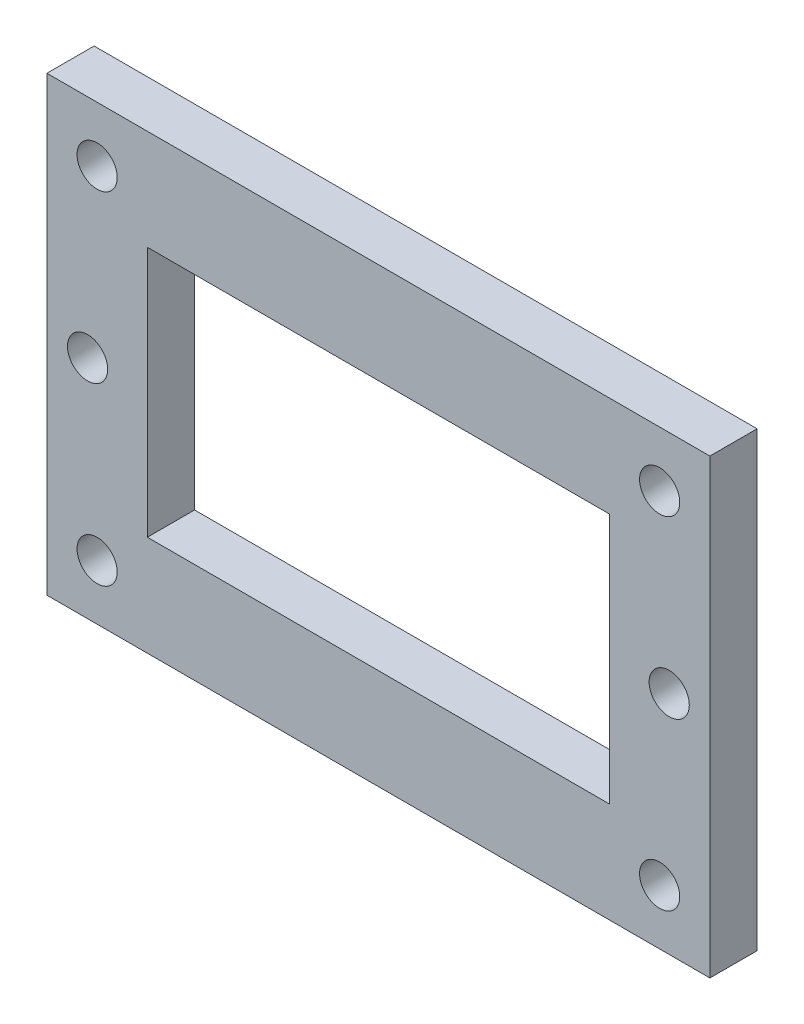
ISO-10303-21;
HEADER;
FILE_DESCRIPTION(('STEP AP214'),'2;1');
FILE_NAME('part.step','',(''),(''),'','','');
FILE_SCHEMA(('AUTOMOTIVE_DESIGN { 1 0 10303 214 1 1 1 1 }'));
ENDSEC;
DATA;
#1=APPLICATION_CONTEXT('core data for automotive mechanical design processes');
#2=APPLICATION_PROTOCOL_DEFINITION('international standard','automotive_design',2000,#1);
#3=PRODUCT_CONTEXT('',#1,'mechanical');
#4=PRODUCT('Part','Part','',(#3));
#5=PRODUCT_RELATED_PRODUCT_CATEGORY('part','',(#4));
#6=PRODUCT_DEFINITION_FORMATION('','',#4);
#7=PRODUCT_DEFINITION_CONTEXT('part definition',#1,'design');
#8=PRODUCT_DEFINITION('design','',#6,#7);
#9=PRODUCT_DEFINITION_SHAPE('','',#8);
#10=(LENGTH_UNIT() NAMED_UNIT(*) SI_UNIT(.MILLI.,.METRE.));
#11=(NAMED_UNIT(*) PLANE_ANGLE_UNIT() SI_UNIT($,.RADIAN.));
#12=(NAMED_UNIT(*) SI_UNIT($,.STERADIAN.) SOLID_ANGLE_UNIT());
#13=UNCERTAINTY_MEASURE_WITH_UNIT(LENGTH_MEASURE(1.E-05),#10,'distance_accuracy_value','');
#14=(GEOMETRIC_REPRESENTATION_CONTEXT(3) GLOBAL_UNCERTAINTY_ASSIGNED_CONTEXT((#13)) GLOBAL_UNIT_ASSIGNED_CONTEXT((#10,
#11,#12)) REPRESENTATION_CONTEXT('',''));
#15=CARTESIAN_POINT('',(0.,0.,0.));
#16=DIRECTION('',(0.,0.,1.));
#17=DIRECTION('',(1.,0.,0.));
#18=AXIS2_PLACEMENT_3D('',#15,#16,#17);
#19=CARTESIAN_POINT('',(0.,0.,2.35));
#20=DIRECTION('',(0.,0.,-1.));
#21=DIRECTION('',(-1.,0.,0.));
#22=AXIS2_PLACEMENT_3D('',#19,#20,#21);
#23=PLANE('',#22);
#24=CARTESIAN_POINT('',(-14.475,0.,2.35));
#25=DIRECTION('',(0.,0.,-1.));
#26=DIRECTION('',(-1.,0.,0.));
#27=AXIS2_PLACEMENT_3D('',#24,#25,#26);
#28=CIRCLE('',#27,1.);
#29=CARTESIAN_POINT('',(-15.475,0.,2.35));
#30=VERTEX_POINT('',#29);
#31=EDGE_CURVE('E250',#30,#30,#28,.T.);
#32=ORIENTED_EDGE('',*,*,#31,.T.);
#33=EDGE_LOOP('',(#32));
#34=FACE_BOUND('',#33,.T.);
#35=CARTESIAN_POINT('',(14.475,0.,2.35));
#36=DIRECTION('',(0.,0.,1.));
#37=DIRECTION('',(1.,0.,0.));
#38=AXIS2_PLACEMENT_3D('',#35,#36,#37);
#39=CIRCLE('',#38,1.);
#40=CARTESIAN_POINT('',(15.475,0.,2.35));
#41=VERTEX_POINT('',#40);
#42=EDGE_CURVE('E252',#41,#41,#39,.T.);
#43=ORIENTED_EDGE('',*,*,#42,.F.);
#44=EDGE_LOOP('',(#43));
#45=FACE_BOUND('',#44,.T.);
#46=CARTESIAN_POINT('',(14.,8.5,2.35));
#47=DIRECTION('',(0.,0.,-1.));
#48=DIRECTION('',(-1.,0.,0.));
#49=AXIS2_PLACEMENT_3D('',#46,#47,#48);
#50=CIRCLE('',#49,0.999999999999999);
#51=CARTESIAN_POINT('',(13.,8.5,2.35));
#52=VERTEX_POINT('',#51);
#53=EDGE_CURVE('E258',#52,#52,#50,.T.);
#54=ORIENTED_EDGE('',*,*,#53,.T.);
#55=EDGE_LOOP('',(#54));
#56=FACE_BOUND('',#55,.T.);
#57=CARTESIAN_POINT('',(14.,-8.5,2.35));
#58=DIRECTION('',(0.,0.,1.));
#59=DIRECTION('',(-1.,0.,0.));
#60=AXIS2_PLACEMENT_3D('',#57,#58,#59);
#61=CIRCLE('',#60,0.999999999999999);
#62=CARTESIAN_POINT('',(13.,-8.5,2.35));
#63=VERTEX_POINT('',#62);
#64=EDGE_CURVE('E264',#63,#63,#61,.T.);
#65=ORIENTED_EDGE('',*,*,#64,.F.);
#66=EDGE_LOOP('',(#65));
#67=FACE_BOUND('',#66,.T.);
#68=CARTESIAN_POINT('',(-14.,-8.5,2.35));
#69=DIRECTION('',(0.,0.,-1.));
#70=DIRECTION('',(1.,0.,0.));
#71=AXIS2_PLACEMENT_3D('',#68,#69,#70);
#72=CIRCLE('',#71,0.999999999999999);
#73=CARTESIAN_POINT('',(-13.,-8.5,2.35));
#74=VERTEX_POINT('',#73);
#75=EDGE_CURVE('E270',#74,#74,#72,.T.);
#76=ORIENTED_EDGE('',*,*,#75,.T.);
#77=EDGE_LOOP('',(#76));
#78=FACE_BOUND('',#77,.T.);
#79=CARTESIAN_POINT('',(-14.,8.5,2.35));
#80=DIRECTION('',(0.,0.,1.));
#81=DIRECTION('',(1.,0.,0.));
#82=AXIS2_PLACEMENT_3D('',#79,#80,#81);
#83=CIRCLE('',#82,0.999999999999999);
#84=CARTESIAN_POINT('',(-13.,8.5,2.35));
#85=VERTEX_POINT('',#84);
#86=EDGE_CURVE('E276',#85,#85,#83,.T.);
#87=ORIENTED_EDGE('',*,*,#86,.F.);
#88=EDGE_LOOP('',(#87));
#89=FACE_BOUND('',#88,.T.);
#90=DIRECTION('',(0.,-1.,0.));
#91=VECTOR('',#90,1.);
#92=CARTESIAN_POINT('',(-16.5,11.25,2.35));
#93=LINE('',#92,#91);
#94=CARTESIAN_POINT('',(-16.5,11.25,2.35));
#95=VERTEX_POINT('',#94);
#96=CARTESIAN_POINT('',(-16.5,-11.25,2.35));
#97=VERTEX_POINT('',#96);
#98=EDGE_CURVE('E140',#95,#97,#93,.T.);
#99=ORIENTED_EDGE('',*,*,#98,.T.);
#100=DIRECTION('',(1.,0.,0.));
#101=VECTOR('',#100,1.);
#102=CARTESIAN_POINT('',(16.5,-11.25,2.35));
#103=LINE('',#102,#101);
#104=CARTESIAN_POINT('',(16.5,-11.25,2.35));
#105=VERTEX_POINT('',#104);
#106=EDGE_CURVE('E143',#97,#105,#103,.T.);
#107=ORIENTED_EDGE('',*,*,#106,.T.);
#108=DIRECTION('',(0.,1.,0.));
#109=VECTOR('',#108,1.);
#110=CARTESIAN_POINT('',(16.5,11.25,2.35));
#111=LINE('',#110,#109);
#112=CARTESIAN_POINT('',(16.5,11.25,2.35));
#113=VERTEX_POINT('',#112);
#114=EDGE_CURVE('E146',#105,#113,#111,.T.);
#115=ORIENTED_EDGE('',*,*,#114,.T.);
#116=DIRECTION('',(-1.,0.,0.));
#117=VECTOR('',#116,1.);
#118=CARTESIAN_POINT('',(16.5,11.25,2.35));
#119=LINE('',#118,#117);
#120=EDGE_CURVE('E148',#113,#95,#119,.T.);
#121=ORIENTED_EDGE('',*,*,#120,.T.);
#122=EDGE_LOOP('',(#99,#107,#115,#121));
#123=FACE_BOUND('',#122,.T.);
#124=DIRECTION('',(0.,-1.,0.));
#125=VECTOR('',#124,1.);
#126=CARTESIAN_POINT('',(-11.5,6.25,2.35));
#127=LINE('',#126,#125);
#128=CARTESIAN_POINT('',(-11.5,6.25,2.35));
#129=VERTEX_POINT('',#128);
#130=CARTESIAN_POINT('',(-11.5,-6.25,2.35));
#131=VERTEX_POINT('',#130);
#132=EDGE_CURVE('E102',#129,#131,#127,.T.);
#133=ORIENTED_EDGE('',*,*,#132,.F.);
#134=DIRECTION('',(-1.,0.,0.));
#135=VECTOR('',#134,1.);
#136=CARTESIAN_POINT('',(11.5,6.25,2.35));
#137=LINE('',#136,#135);
#138=CARTESIAN_POINT('',(11.5,6.25,2.35));
#139=VERTEX_POINT('',#138);
#140=EDGE_CURVE('E124',#139,#129,#137,.T.);
#141=ORIENTED_EDGE('',*,*,#140,.F.);
#142=DIRECTION('',(0.,1.,0.));
#143=VECTOR('',#142,1.);
#144=CARTESIAN_POINT('',(11.5,6.25,2.35));
#145=LINE('',#144,#143);
#146=CARTESIAN_POINT('',(11.5,-6.25,2.35));
#147=VERTEX_POINT('',#146);
#148=EDGE_CURVE('E122',#147,#139,#145,.T.);
#149=ORIENTED_EDGE('',*,*,#148,.F.);
#150=DIRECTION('',(1.,0.,0.));
#151=VECTOR('',#150,1.);
#152=CARTESIAN_POINT('',(11.5,-6.25,2.35));
#153=LINE('',#152,#151);
#154=EDGE_CURVE('E110',#131,#147,#153,.T.);
#155=ORIENTED_EDGE('',*,*,#154,.F.);
#156=EDGE_LOOP('',(#133,#141,#149,#155));
#157=FACE_BOUND('',#156,.T.);
#158=ADVANCED_FACE('F37',(#34,#45,#56,#67,#78,#89,#123,#157),#23,.F.);
#159=CARTESIAN_POINT('',(0.,0.,0.));
#160=DIRECTION('',(0.,0.,-1.));
#161=DIRECTION('',(-1.,0.,0.));
#162=AXIS2_PLACEMENT_3D('',#159,#160,#161);
#163=PLANE('',#162);
#164=CARTESIAN_POINT('',(-14.475,0.,0.));
#165=DIRECTION('',(0.,0.,-1.));
#166=DIRECTION('',(-1.,0.,0.));
#167=AXIS2_PLACEMENT_3D('',#164,#165,#166);
#168=CIRCLE('',#167,1.);
#169=CARTESIAN_POINT('',(-15.475,0.,0.));
#170=VERTEX_POINT('',#169);
#171=EDGE_CURVE('E248',#170,#170,#168,.T.);
#172=ORIENTED_EDGE('',*,*,#171,.F.);
#173=EDGE_LOOP('',(#172));
#174=FACE_BOUND('',#173,.T.);
#175=CARTESIAN_POINT('',(14.475,0.,0.));
#176=DIRECTION('',(0.,0.,1.));
#177=DIRECTION('',(1.,0.,0.));
#178=AXIS2_PLACEMENT_3D('',#175,#176,#177);
#179=CIRCLE('',#178,1.);
#180=CARTESIAN_POINT('',(15.475,0.,0.));
#181=VERTEX_POINT('',#180);
#182=EDGE_CURVE('E255',#181,#181,#179,.T.);
#183=ORIENTED_EDGE('',*,*,#182,.T.);
#184=EDGE_LOOP('',(#183));
#185=FACE_BOUND('',#184,.T.);
#186=CARTESIAN_POINT('',(14.,8.5,0.));
#187=DIRECTION('',(0.,0.,-1.));
#188=DIRECTION('',(-1.,0.,0.));
#189=AXIS2_PLACEMENT_3D('',#186,#187,#188);
#190=CIRCLE('',#189,0.999999999999999);
#191=CARTESIAN_POINT('',(13.,8.5,0.));
#192=VERTEX_POINT('',#191);
#193=EDGE_CURVE('E261',#192,#192,#190,.T.);
#194=ORIENTED_EDGE('',*,*,#193,.F.);
#195=EDGE_LOOP('',(#194));
#196=FACE_BOUND('',#195,.T.);
#197=CARTESIAN_POINT('',(14.,-8.5,0.));
#198=DIRECTION('',(0.,0.,1.));
#199=DIRECTION('',(-1.,0.,0.));
#200=AXIS2_PLACEMENT_3D('',#197,#198,#199);
#201=CIRCLE('',#200,0.999999999999999);
#202=CARTESIAN_POINT('',(13.,-8.5,0.));
#203=VERTEX_POINT('',#202);
#204=EDGE_CURVE('E267',#203,#203,#201,.T.);
#205=ORIENTED_EDGE('',*,*,#204,.T.);
#206=EDGE_LOOP('',(#205));
#207=FACE_BOUND('',#206,.T.);
#208=CARTESIAN_POINT('',(-14.,-8.5,0.));
#209=DIRECTION('',(0.,0.,-1.));
#210=DIRECTION('',(1.,0.,0.));
#211=AXIS2_PLACEMENT_3D('',#208,#209,#210);
#212=CIRCLE('',#211,0.999999999999999);
#213=CARTESIAN_POINT('',(-13.,-8.5,0.));
#214=VERTEX_POINT('',#213);
#215=EDGE_CURVE('E273',#214,#214,#212,.T.);
#216=ORIENTED_EDGE('',*,*,#215,.F.);
#217=EDGE_LOOP('',(#216));
#218=FACE_BOUND('',#217,.T.);
#219=CARTESIAN_POINT('',(-14.,8.5,0.));
#220=DIRECTION('',(0.,0.,1.));
#221=DIRECTION('',(1.,0.,0.));
#222=AXIS2_PLACEMENT_3D('',#219,#220,#221);
#223=CIRCLE('',#222,0.999999999999999);
#224=CARTESIAN_POINT('',(-13.,8.5,0.));
#225=VERTEX_POINT('',#224);
#226=EDGE_CURVE('E130',#225,#225,#223,.T.);
#227=ORIENTED_EDGE('',*,*,#226,.T.);
#228=EDGE_LOOP('',(#227));
#229=FACE_BOUND('',#228,.T.);
#230=DIRECTION('',(0.,-1.,0.));
#231=VECTOR('',#230,1.);
#232=CARTESIAN_POINT('',(-16.5,11.25,0.));
#233=LINE('',#232,#231);
#234=CARTESIAN_POINT('',(-16.5,11.25,0.));
#235=VERTEX_POINT('',#234);
#236=CARTESIAN_POINT('',(-16.5,-11.25,0.));
#237=VERTEX_POINT('',#236);
#238=EDGE_CURVE('E118',#235,#237,#233,.T.);
#239=ORIENTED_EDGE('',*,*,#238,.F.);
#240=DIRECTION('',(-1.,0.,0.));
#241=VECTOR('',#240,1.);
#242=CARTESIAN_POINT('',(16.5,11.25,0.));
#243=LINE('',#242,#241);
#244=CARTESIAN_POINT('',(16.5,11.25,0.));
#245=VERTEX_POINT('',#244);
#246=EDGE_CURVE('E144',#245,#235,#243,.T.);
#247=ORIENTED_EDGE('',*,*,#246,.F.);
#248=DIRECTION('',(0.,1.,0.));
#249=VECTOR('',#248,1.);
#250=CARTESIAN_POINT('',(16.5,11.25,0.));
#251=LINE('',#250,#249);
#252=CARTESIAN_POINT('',(16.5,-11.25,0.));
#253=VERTEX_POINT('',#252);
#254=EDGE_CURVE('E155',#253,#245,#251,.T.);
#255=ORIENTED_EDGE('',*,*,#254,.F.);
#256=DIRECTION('',(1.,0.,0.));
#257=VECTOR('',#256,1.);
#258=CARTESIAN_POINT('',(16.5,-11.25,0.));
#259=LINE('',#258,#257);
#260=EDGE_CURVE('E153',#237,#253,#259,.T.);
#261=ORIENTED_EDGE('',*,*,#260,.F.);
#262=EDGE_LOOP('',(#239,#247,#255,#261));
#263=FACE_BOUND('',#262,.T.);
#264=DIRECTION('',(-1.,0.,0.));
#265=VECTOR('',#264,1.);
#266=CARTESIAN_POINT('',(11.5,6.25,0.));
#267=LINE('',#266,#265);
#268=CARTESIAN_POINT('',(11.5,6.25,0.));
#269=VERTEX_POINT('',#268);
#270=CARTESIAN_POINT('',(-11.5,6.25,0.));
#271=VERTEX_POINT('',#270);
#272=EDGE_CURVE('E111',#269,#271,#267,.T.);
#273=ORIENTED_EDGE('',*,*,#272,.T.);
#274=DIRECTION('',(0.,-1.,0.));
#275=VECTOR('',#274,1.);
#276=CARTESIAN_POINT('',(-11.5,6.25,0.));
#277=LINE('',#276,#275);
#278=CARTESIAN_POINT('',(-11.5,-6.25,0.));
#279=VERTEX_POINT('',#278);
#280=EDGE_CURVE('E60',#271,#279,#277,.T.);
#281=ORIENTED_EDGE('',*,*,#280,.T.);
#282=DIRECTION('',(1.,0.,0.));
#283=VECTOR('',#282,1.);
#284=CARTESIAN_POINT('',(11.5,-6.25,0.));
#285=LINE('',#284,#283);
#286=CARTESIAN_POINT('',(11.5,-6.25,0.));
#287=VERTEX_POINT('',#286);
#288=EDGE_CURVE('E117',#279,#287,#285,.T.);
#289=ORIENTED_EDGE('',*,*,#288,.T.);
#290=DIRECTION('',(0.,1.,0.));
#291=VECTOR('',#290,1.);
#292=CARTESIAN_POINT('',(11.5,6.25,0.));
#293=LINE('',#292,#291);
#294=EDGE_CURVE('E132',#287,#269,#293,.T.);
#295=ORIENTED_EDGE('',*,*,#294,.T.);
#296=EDGE_LOOP('',(#273,#281,#289,#295));
#297=FACE_BOUND('',#296,.T.);
#298=ADVANCED_FACE('F173',(#174,#185,#196,#207,#218,#229,#263,#297),#163,.T.);
#299=CARTESIAN_POINT('',(-16.5,11.25,2.35));
#300=DIRECTION('',(1.,0.,0.));
#301=DIRECTION('',(0.,0.,-1.));
#302=AXIS2_PLACEMENT_3D('',#299,#300,#301);
#303=PLANE('',#302);
#304=ORIENTED_EDGE('',*,*,#238,.T.);
#305=DIRECTION('',(0.,0.,-1.));
#306=VECTOR('',#305,1.);
#307=CARTESIAN_POINT('',(-16.5,-11.25,2.35));
#308=LINE('',#307,#306);
#309=EDGE_CURVE('E11',#97,#237,#308,.T.);
#310=ORIENTED_EDGE('',*,*,#309,.F.);
#311=ORIENTED_EDGE('',*,*,#98,.F.);
#312=DIRECTION('',(0.,0.,-1.));
#313=VECTOR('',#312,1.);
#314=CARTESIAN_POINT('',(-16.5,11.25,2.35));
#315=LINE('',#314,#313);
#316=EDGE_CURVE('E150',#95,#235,#315,.T.);
#317=ORIENTED_EDGE('',*,*,#316,.T.);
#318=EDGE_LOOP('',(#304,#310,#311,#317));
#319=FACE_BOUND('',#318,.T.);
#320=ADVANCED_FACE('F39',(#319),#303,.F.);
#321=CARTESIAN_POINT('',(16.5,-11.25,2.35));
#322=DIRECTION('',(0.,1.,0.));
#323=DIRECTION('',(0.,0.,1.));
#324=AXIS2_PLACEMENT_3D('',#321,#322,#323);
#325=PLANE('',#324);
#326=ORIENTED_EDGE('',*,*,#260,.T.);
#327=DIRECTION('',(0.,0.,-1.));
#328=VECTOR('',#327,1.);
#329=CARTESIAN_POINT('',(16.5,-11.25,2.35));
#330=LINE('',#329,#328);
#331=EDGE_CURVE('E45',#105,#253,#330,.T.);
#332=ORIENTED_EDGE('',*,*,#331,.F.);
#333=ORIENTED_EDGE('',*,*,#106,.F.);
#334=ORIENTED_EDGE('',*,*,#309,.T.);
#335=EDGE_LOOP('',(#326,#332,#333,#334));
#336=FACE_BOUND('',#335,.T.);
#337=ADVANCED_FACE('F183',(#336),#325,.F.);
#338=CARTESIAN_POINT('',(16.5,11.25,2.35));
#339=DIRECTION('',(-1.,0.,0.));
#340=DIRECTION('',(0.,0.,1.));
#341=AXIS2_PLACEMENT_3D('',#338,#339,#340);
#342=PLANE('',#341);
#343=ORIENTED_EDGE('',*,*,#254,.T.);
#344=DIRECTION('',(0.,0.,-1.));
#345=VECTOR('',#344,1.);
#346=CARTESIAN_POINT('',(16.5,11.25,2.35));
#347=LINE('',#346,#345);
#348=EDGE_CURVE('E160',#113,#245,#347,.T.);
#349=ORIENTED_EDGE('',*,*,#348,.F.);
#350=ORIENTED_EDGE('',*,*,#114,.F.);
#351=ORIENTED_EDGE('',*,*,#331,.T.);
#352=EDGE_LOOP('',(#343,#349,#350,#351));
#353=FACE_BOUND('',#352,.T.);
#354=ADVANCED_FACE('F167',(#353),#342,.F.);
#355=CARTESIAN_POINT('',(16.5,11.25,2.35));
#356=DIRECTION('',(0.,-1.,0.));
#357=DIRECTION('',(0.,0.,-1.));
#358=AXIS2_PLACEMENT_3D('',#355,#356,#357);
#359=PLANE('',#358);
#360=ORIENTED_EDGE('',*,*,#246,.T.);
#361=ORIENTED_EDGE('',*,*,#316,.F.);
#362=ORIENTED_EDGE('',*,*,#120,.F.);
#363=ORIENTED_EDGE('',*,*,#348,.T.);
#364=EDGE_LOOP('',(#360,#361,#362,#363));
#365=FACE_BOUND('',#364,.T.);
#366=ADVANCED_FACE('F177',(#365),#359,.F.);
#367=CARTESIAN_POINT('',(-11.5,6.25,2.35));
#368=DIRECTION('',(1.,0.,0.));
#369=DIRECTION('',(0.,1.,0.));
#370=AXIS2_PLACEMENT_3D('',#367,#368,#369);
#371=PLANE('',#370);
#372=ORIENTED_EDGE('',*,*,#280,.F.);
#373=DIRECTION('',(0.,0.,-1.));
#374=VECTOR('',#373,1.);
#375=CARTESIAN_POINT('',(-11.5,6.25,2.35));
#376=LINE('',#375,#374);
#377=EDGE_CURVE('E106',#129,#271,#376,.T.);
#378=ORIENTED_EDGE('',*,*,#377,.F.);
#379=ORIENTED_EDGE('',*,*,#132,.T.);
#380=DIRECTION('',(0.,0.,-1.));
#381=VECTOR('',#380,1.);
#382=CARTESIAN_POINT('',(-11.5,-6.25,2.35));
#383=LINE('',#382,#381);
#384=EDGE_CURVE('E105',#131,#279,#383,.T.);
#385=ORIENTED_EDGE('',*,*,#384,.T.);
#386=EDGE_LOOP('',(#372,#378,#379,#385));
#387=FACE_BOUND('',#386,.T.);
#388=ADVANCED_FACE('F104',(#387),#371,.T.);
#389=CARTESIAN_POINT('',(11.5,-6.25,2.35));
#390=DIRECTION('',(0.,1.,0.));
#391=DIRECTION('',(-1.,0.,0.));
#392=AXIS2_PLACEMENT_3D('',#389,#390,#391);
#393=PLANE('',#392);
#394=ORIENTED_EDGE('',*,*,#288,.F.);
#395=ORIENTED_EDGE('',*,*,#384,.F.);
#396=ORIENTED_EDGE('',*,*,#154,.T.);
#397=DIRECTION('',(0.,0.,-1.));
#398=VECTOR('',#397,1.);
#399=CARTESIAN_POINT('',(11.5,-6.25,2.35));
#400=LINE('',#399,#398);
#401=EDGE_CURVE('E119',#147,#287,#400,.T.);
#402=ORIENTED_EDGE('',*,*,#401,.T.);
#403=EDGE_LOOP('',(#394,#395,#396,#402));
#404=FACE_BOUND('',#403,.T.);
#405=ADVANCED_FACE('F114',(#404),#393,.T.);
#406=CARTESIAN_POINT('',(11.5,6.25,2.35));
#407=DIRECTION('',(-1.,0.,0.));
#408=DIRECTION('',(0.,0.,1.));
#409=AXIS2_PLACEMENT_3D('',#406,#407,#408);
#410=PLANE('',#409);
#411=ORIENTED_EDGE('',*,*,#294,.F.);
#412=ORIENTED_EDGE('',*,*,#401,.F.);
#413=ORIENTED_EDGE('',*,*,#148,.T.);
#414=DIRECTION('',(0.,0.,-1.));
#415=VECTOR('',#414,1.);
#416=CARTESIAN_POINT('',(11.5,6.25,2.35));
#417=LINE('',#416,#415);
#418=EDGE_CURVE('E52',#139,#269,#417,.T.);
#419=ORIENTED_EDGE('',*,*,#418,.T.);
#420=EDGE_LOOP('',(#411,#412,#413,#419));
#421=FACE_BOUND('',#420,.T.);
#422=ADVANCED_FACE('F210',(#421),#410,.T.);
#423=CARTESIAN_POINT('',(11.5,6.25,2.35));
#424=DIRECTION('',(0.,-1.,0.));
#425=DIRECTION('',(1.,0.,0.));
#426=AXIS2_PLACEMENT_3D('',#423,#424,#425);
#427=PLANE('',#426);
#428=ORIENTED_EDGE('',*,*,#272,.F.);
#429=ORIENTED_EDGE('',*,*,#418,.F.);
#430=ORIENTED_EDGE('',*,*,#140,.T.);
#431=ORIENTED_EDGE('',*,*,#377,.T.);
#432=EDGE_LOOP('',(#428,#429,#430,#431));
#433=FACE_BOUND('',#432,.T.);
#434=ADVANCED_FACE('F214',(#433),#427,.T.);
#435=CARTESIAN_POINT('',(-14.,8.5,0.));
#436=DIRECTION('',(0.,0.,1.));
#437=DIRECTION('',(1.,0.,0.));
#438=AXIS2_PLACEMENT_3D('',#435,#436,#437);
#439=CYLINDRICAL_SURFACE('',#438,0.999999999999999);
#440=ORIENTED_EDGE('',*,*,#226,.F.);
#441=EDGE_LOOP('',(#440));
#442=FACE_BOUND('',#441,.T.);
#443=ORIENTED_EDGE('',*,*,#86,.T.);
#444=EDGE_LOOP('',(#443));
#445=FACE_BOUND('',#444,.T.);
#446=ADVANCED_FACE('F220',(#442,#445),#439,.F.);
#447=CARTESIAN_POINT('',(-14.,-8.5,0.));
#448=DIRECTION('',(0.,0.,1.));
#449=DIRECTION('',(1.,0.,0.));
#450=AXIS2_PLACEMENT_3D('',#447,#448,#449);
#451=CYLINDRICAL_SURFACE('',#450,0.999999999999999);
#452=ORIENTED_EDGE('',*,*,#215,.T.);
#453=EDGE_LOOP('',(#452));
#454=FACE_BOUND('',#453,.T.);
#455=ORIENTED_EDGE('',*,*,#75,.F.);
#456=EDGE_LOOP('',(#455));
#457=FACE_BOUND('',#456,.T.);
#458=ADVANCED_FACE('F223',(#454,#457),#451,.F.);
#459=CARTESIAN_POINT('',(14.,-8.5,0.));
#460=DIRECTION('',(0.,0.,1.));
#461=DIRECTION('',(1.,0.,0.));
#462=AXIS2_PLACEMENT_3D('',#459,#460,#461);
#463=CYLINDRICAL_SURFACE('',#462,0.999999999999999);
#464=ORIENTED_EDGE('',*,*,#204,.F.);
#465=EDGE_LOOP('',(#464));
#466=FACE_BOUND('',#465,.T.);
#467=ORIENTED_EDGE('',*,*,#64,.T.);
#468=EDGE_LOOP('',(#467));
#469=FACE_BOUND('',#468,.T.);
#470=ADVANCED_FACE('F227',(#466,#469),#463,.F.);
#471=CARTESIAN_POINT('',(14.,8.5,0.));
#472=DIRECTION('',(0.,0.,1.));
#473=DIRECTION('',(1.,0.,0.));
#474=AXIS2_PLACEMENT_3D('',#471,#472,#473);
#475=CYLINDRICAL_SURFACE('',#474,0.999999999999999);
#476=ORIENTED_EDGE('',*,*,#193,.T.);
#477=EDGE_LOOP('',(#476));
#478=FACE_BOUND('',#477,.T.);
#479=ORIENTED_EDGE('',*,*,#53,.F.);
#480=EDGE_LOOP('',(#479));
#481=FACE_BOUND('',#480,.T.);
#482=ADVANCED_FACE('F231',(#478,#481),#475,.F.);
#483=CARTESIAN_POINT('',(14.475,0.,0.));
#484=DIRECTION('',(0.,0.,1.));
#485=DIRECTION('',(1.,0.,0.));
#486=AXIS2_PLACEMENT_3D('',#483,#484,#485);
#487=CYLINDRICAL_SURFACE('',#486,1.);
#488=ORIENTED_EDGE('',*,*,#182,.F.);
#489=EDGE_LOOP('',(#488));
#490=FACE_BOUND('',#489,.T.);
#491=ORIENTED_EDGE('',*,*,#42,.T.);
#492=EDGE_LOOP('',(#491));
#493=FACE_BOUND('',#492,.T.);
#494=ADVANCED_FACE('F235',(#490,#493),#487,.F.);
#495=CARTESIAN_POINT('',(-14.475,0.,0.));
#496=DIRECTION('',(0.,0.,1.));
#497=DIRECTION('',(1.,0.,0.));
#498=AXIS2_PLACEMENT_3D('',#495,#496,#497);
#499=CYLINDRICAL_SURFACE('',#498,1.);
#500=ORIENTED_EDGE('',*,*,#171,.T.);
#501=EDGE_LOOP('',(#500));
#502=FACE_BOUND('',#501,.T.);
#503=ORIENTED_EDGE('',*,*,#31,.F.);
#504=EDGE_LOOP('',(#503));
#505=FACE_BOUND('',#504,.T.);
#506=ADVANCED_FACE('F239',(#502,#505),#499,.F.);
#507=CLOSED_SHELL('',(#158,#298,#320,#337,#354,#366,#388,#405,#422,#434,#446,#458,#470,#482,
#494,#506));
#508=MANIFOLD_SOLID_BREP('B2',#507);
#509=ADVANCED_BREP_SHAPE_REPRESENTATION('',(#18,#508),#14);
#510=SHAPE_DEFINITION_REPRESENTATION(#9,#509);
ENDSEC;
END-ISO-10303-21;
